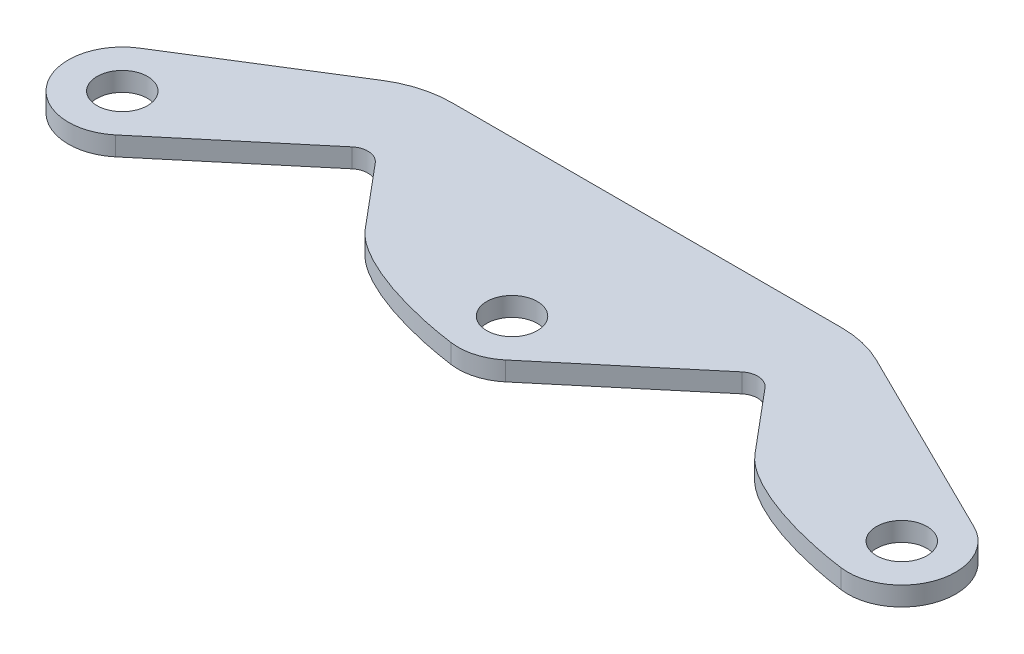
ISO-10303-21;
HEADER;
FILE_DESCRIPTION(('STEP AP214'),'2;1');
FILE_NAME('part.step','',(''),(''),'','','');
FILE_SCHEMA(('AUTOMOTIVE_DESIGN { 1 0 10303 214 1 1 1 1 }'));
ENDSEC;
DATA;
#1=APPLICATION_CONTEXT('core data for automotive mechanical design processes');
#2=APPLICATION_PROTOCOL_DEFINITION('international standard','automotive_design',2000,#1);
#3=PRODUCT_CONTEXT('',#1,'mechanical');
#4=PRODUCT('Part','Part','',(#3));
#5=PRODUCT_RELATED_PRODUCT_CATEGORY('part','',(#4));
#6=PRODUCT_DEFINITION_FORMATION('','',#4);
#7=PRODUCT_DEFINITION_CONTEXT('part definition',#1,'design');
#8=PRODUCT_DEFINITION('design','',#6,#7);
#9=PRODUCT_DEFINITION_SHAPE('','',#8);
#10=(LENGTH_UNIT() NAMED_UNIT(*) SI_UNIT(.MILLI.,.METRE.));
#11=(NAMED_UNIT(*) PLANE_ANGLE_UNIT() SI_UNIT($,.RADIAN.));
#12=(NAMED_UNIT(*) SI_UNIT($,.STERADIAN.) SOLID_ANGLE_UNIT());
#13=UNCERTAINTY_MEASURE_WITH_UNIT(LENGTH_MEASURE(1.E-05),#10,'distance_accuracy_value','');
#14=(GEOMETRIC_REPRESENTATION_CONTEXT(3) GLOBAL_UNCERTAINTY_ASSIGNED_CONTEXT((#13)) GLOBAL_UNIT_ASSIGNED_CONTEXT((#10,
#11,#12)) REPRESENTATION_CONTEXT('',''));
#15=CARTESIAN_POINT('',(0.,0.,0.));
#16=DIRECTION('',(0.,0.,1.));
#17=DIRECTION('',(1.,0.,0.));
#18=AXIS2_PLACEMENT_3D('',#15,#16,#17);
#19=CARTESIAN_POINT('',(-65.,3.175,4.53892574049608E-13));
#20=DIRECTION('',(0.,1.,0.));
#21=DIRECTION('',(0.,0.,1.));
#22=AXIS2_PLACEMENT_3D('',#19,#20,#21);
#23=PLANE('',#22);
#24=CARTESIAN_POINT('',(-65.,3.175,4.53892590361469E-13));
#25=DIRECTION('',(0.,1.,0.));
#26=DIRECTION('',(0.,0.,1.));
#27=AXIS2_PLACEMENT_3D('',#24,#25,#26);
#28=CIRCLE('',#27,4.21639999999987);
#29=CARTESIAN_POINT('',(-65.,3.175,4.21640000000033));
#30=VERTEX_POINT('',#29);
#31=EDGE_CURVE('E353',#30,#30,#28,.T.);
#32=ORIENTED_EDGE('',*,*,#31,.F.);
#33=EDGE_LOOP('',(#32));
#34=FACE_BOUND('',#33,.T.);
#35=CARTESIAN_POINT('',(-130.,3.175,9.07785148099215E-13));
#36=DIRECTION('',(0.,1.,0.));
#37=DIRECTION('',(0.,0.,1.));
#38=AXIS2_PLACEMENT_3D('',#35,#36,#37);
#39=CIRCLE('',#38,9.);
#40=CARTESIAN_POINT('',(-134.772811817146,3.175,-7.63022066247776));
#41=VERTEX_POINT('',#40);
#42=CARTESIAN_POINT('',(-124.214911512821,3.175,6.89439998807173));
#43=VERTEX_POINT('',#42);
#44=EDGE_CURVE('E211',#41,#43,#39,.T.);
#45=ORIENTED_EDGE('',*,*,#44,.T.);
#46=DIRECTION('',(0.766044443118981,0.,-0.642787609686536));
#47=VECTOR('',#46,1.);
#48=CARTESIAN_POINT('',(-124.214911512821,3.175,6.89439998807173));
#49=LINE('',#48,#47);
#50=CARTESIAN_POINT('',(-102.76566710549,3.175,-11.1036530831513));
#51=VERTEX_POINT('',#50);
#52=EDGE_CURVE('E119',#43,#51,#49,.T.);
#53=ORIENTED_EDGE('',*,*,#52,.T.);
#54=CARTESIAN_POINT('',(-100.83730427643,3.175,-8.80551975379434));
#55=DIRECTION('',(0.,-1.,0.));
#56=DIRECTION('',(0.,0.,1.));
#57=AXIS2_PLACEMENT_3D('',#54,#55,#56);
#58=CIRCLE('',#57,3.);
#59=CARTESIAN_POINT('',(-98.5391709470731,3.175,-10.733882582854));
#60=VERTEX_POINT('',#59);
#61=EDGE_CURVE('E250',#51,#60,#58,.T.);
#62=ORIENTED_EDGE('',*,*,#61,.T.);
#63=DIRECTION('',(0.64278760968654,0.,0.766044443118977));
#64=VECTOR('',#63,1.);
#65=CARTESIAN_POINT('',(-89.7352473954924,3.175,-0.241775061332787));
#66=LINE('',#65,#64);
#67=CARTESIAN_POINT('',(-89.7352473954924,3.175,-0.24177506133276));
#68=VERTEX_POINT('',#67);
#69=EDGE_CURVE('E269',#60,#68,#66,.T.);
#70=ORIENTED_EDGE('',*,*,#69,.T.);
#71=CARTESIAN_POINT('',(-65.,3.175,4.53892574049608E-13));
#72=DIRECTION('',(0.,1.,0.));
#73=DIRECTION('',(-0.990268068741571,0.,-0.139173100960064));
#74=AXIS2_PLACEMENT_3D('',#71,#72,#73);
#75=ELLIPSE('',#74,26.2466533784144,8.99999999999999);
#76=CARTESIAN_POINT('',(-66.2525579086406,3.175,8.91241261867458));
#77=VERTEX_POINT('',#76);
#78=EDGE_CURVE('E266',#68,#77,#75,.T.);
#79=ORIENTED_EDGE('',*,*,#78,.T.);
#80=CARTESIAN_POINT('',(-65.,3.175,4.53892590361469E-13));
#81=DIRECTION('',(0.,1.,0.));
#82=DIRECTION('',(0.,0.,1.));
#83=AXIS2_PLACEMENT_3D('',#80,#81,#82);
#84=CIRCLE('',#83,9.);
#85=CARTESIAN_POINT('',(-59.2149115128212,3.175,6.89439998807127));
#86=VERTEX_POINT('',#85);
#87=EDGE_CURVE('E268',#77,#86,#84,.T.);
#88=ORIENTED_EDGE('',*,*,#87,.T.);
#89=DIRECTION('',(0.766044443118981,0.,-0.642787609686536));
#90=VECTOR('',#89,1.);
#91=CARTESIAN_POINT('',(-59.2149115128212,3.175,6.89439998807127));
#92=LINE('',#91,#90);
#93=CARTESIAN_POINT('',(-37.7656671054897,3.175,-11.1036530831517));
#94=VERTEX_POINT('',#93);
#95=EDGE_CURVE('E271',#86,#94,#92,.T.);
#96=ORIENTED_EDGE('',*,*,#95,.T.);
#97=CARTESIAN_POINT('',(-35.8373042764301,3.175,-8.8055197537948));
#98=DIRECTION('',(0.,-1.,0.));
#99=DIRECTION('',(0.,0.,1.));
#100=AXIS2_PLACEMENT_3D('',#97,#98,#99);
#101=CIRCLE('',#100,3.);
#102=CARTESIAN_POINT('',(-33.5391709470732,3.175,-10.7338825828544));
#103=VERTEX_POINT('',#102);
#104=EDGE_CURVE('E530',#94,#103,#101,.T.);
#105=ORIENTED_EDGE('',*,*,#104,.T.);
#106=DIRECTION('',(0.64278760968654,0.,0.766044443118978));
#107=VECTOR('',#106,1.);
#108=CARTESIAN_POINT('',(-24.7352473954924,3.175,-0.241775061333241));
#109=LINE('',#108,#107);
#110=CARTESIAN_POINT('',(-24.7352473954924,3.175,-0.241775061333241));
#111=VERTEX_POINT('',#110);
#112=EDGE_CURVE('E335',#103,#111,#109,.T.);
#113=ORIENTED_EDGE('',*,*,#112,.T.);
#114=CARTESIAN_POINT('',(0.,3.175,0.));
#115=DIRECTION('',(0.,1.,0.));
#116=DIRECTION('',(-0.99026806874157,0.,-0.139173100960066));
#117=AXIS2_PLACEMENT_3D('',#114,#115,#116);
#118=ELLIPSE('',#117,26.2466533784144,8.99999999999999);
#119=CARTESIAN_POINT('',(-1.25255790864059,3.175,8.91241261867412));
#120=VERTEX_POINT('',#119);
#121=EDGE_CURVE('E330',#111,#120,#118,.T.);
#122=ORIENTED_EDGE('',*,*,#121,.T.);
#123=CARTESIAN_POINT('',(0.,3.175,0.));
#124=DIRECTION('',(0.,1.,0.));
#125=DIRECTION('',(0.,0.,1.));
#126=AXIS2_PLACEMENT_3D('',#123,#124,#125);
#127=CIRCLE('',#126,8.99999999999999);
#128=CARTESIAN_POINT('',(3.9911232090901,3.175,-8.06665578352406));
#129=VERTEX_POINT('',#128);
#130=EDGE_CURVE('E334',#120,#129,#127,.T.);
#131=ORIENTED_EDGE('',*,*,#130,.T.);
#132=DIRECTION('',(-0.89629508705823,0.,-0.443458134343345));
#133=VECTOR('',#132,1.);
#134=CARTESIAN_POINT('',(-28.2985159925923,3.175,-24.0425362337842));
#135=LINE('',#134,#133);
#136=CARTESIAN_POINT('',(-28.2985159925923,3.175,-24.0425362337842));
#137=VERTEX_POINT('',#136);
#138=EDGE_CURVE('E338',#129,#137,#135,.T.);
#139=ORIENTED_EDGE('',*,*,#138,.T.);
#140=CARTESIAN_POINT('',(-35.8373042764292,3.175,-8.80551975379434));
#141=DIRECTION('',(0.,1.,0.));
#142=DIRECTION('',(0.,0.,-1.));
#143=AXIS2_PLACEMENT_3D('',#140,#141,#142);
#144=CIRCLE('',#143,17.);
#145=CARTESIAN_POINT('',(-35.8373042764292,3.175,-25.8055197537943));
#146=VERTEX_POINT('',#145);
#147=EDGE_CURVE('E162',#137,#146,#144,.T.);
#148=ORIENTED_EDGE('',*,*,#147,.T.);
#149=DIRECTION('',(-1.,0.,0.));
#150=VECTOR('',#149,1.);
#151=CARTESIAN_POINT('',(-100.83730427643,3.175,-25.8055197537943));
#152=LINE('',#151,#150);
#153=CARTESIAN_POINT('',(-100.83730427643,3.175,-25.8055197537943));
#154=VERTEX_POINT('',#153);
#155=EDGE_CURVE('E156',#146,#154,#152,.T.);
#156=ORIENTED_EDGE('',*,*,#155,.T.);
#157=CARTESIAN_POINT('',(-100.83730427643,3.175,-8.80551975379434));
#158=DIRECTION('',(0.,1.,0.));
#159=DIRECTION('',(0.,0.,-1.));
#160=AXIS2_PLACEMENT_3D('',#157,#158,#159);
#161=CIRCLE('',#160,17.);
#162=CARTESIAN_POINT('',(-109.852615486594,3.175,-23.2181587829207));
#163=VERTEX_POINT('',#162);
#164=EDGE_CURVE('E160',#154,#163,#161,.T.);
#165=ORIENTED_EDGE('',*,*,#164,.T.);
#166=DIRECTION('',(-0.847802295830963,0.,0.530312424127276));
#167=VECTOR('',#166,1.);
#168=CARTESIAN_POINT('',(-134.772811817146,3.175,-7.63022066247776));
#169=LINE('',#168,#167);
#170=EDGE_CURVE('E52',#163,#41,#169,.T.);
#171=ORIENTED_EDGE('',*,*,#170,.T.);
#172=EDGE_LOOP('',(#45,#53,#62,#70,#79,#88,#96,#105,#113,#122,#131,#139,#148,#156,#165,#171));
#173=FACE_BOUND('',#172,.T.);
#174=CARTESIAN_POINT('',(0.,3.175,0.));
#175=DIRECTION('',(0.,1.,0.));
#176=DIRECTION('',(0.,0.,1.));
#177=AXIS2_PLACEMENT_3D('',#174,#175,#176);
#178=CIRCLE('',#177,4.2164);
#179=CARTESIAN_POINT('',(0.,3.175,4.2164));
#180=VERTEX_POINT('',#179);
#181=EDGE_CURVE('E184',#180,#180,#178,.T.);
#182=ORIENTED_EDGE('',*,*,#181,.F.);
#183=EDGE_LOOP('',(#182));
#184=FACE_BOUND('',#183,.T.);
#185=CARTESIAN_POINT('',(-130.,3.175,9.07785148099215E-13));
#186=DIRECTION('',(0.,1.,0.));
#187=DIRECTION('',(0.,0.,1.));
#188=AXIS2_PLACEMENT_3D('',#185,#186,#187);
#189=CIRCLE('',#188,4.2164000000003);
#190=CARTESIAN_POINT('',(-130.,3.175,4.21640000000121));
#191=VERTEX_POINT('',#190);
#192=EDGE_CURVE('E359',#191,#191,#189,.T.);
#193=ORIENTED_EDGE('',*,*,#192,.F.);
#194=EDGE_LOOP('',(#193));
#195=FACE_BOUND('',#194,.T.);
#196=ADVANCED_FACE('F35',(#34,#173,#184,#195),#23,.T.);
#197=CARTESIAN_POINT('',(-65.,0.,4.53892574049608E-13));
#198=DIRECTION('',(0.,1.,0.));
#199=DIRECTION('',(0.,0.,1.));
#200=AXIS2_PLACEMENT_3D('',#197,#198,#199);
#201=PLANE('',#200);
#202=CARTESIAN_POINT('',(-130.,0.,9.07785148099215E-13));
#203=DIRECTION('',(0.,1.,0.));
#204=DIRECTION('',(0.,0.,1.));
#205=AXIS2_PLACEMENT_3D('',#202,#203,#204);
#206=CIRCLE('',#205,9.);
#207=CARTESIAN_POINT('',(-134.772811817146,0.,-7.63022066247776));
#208=VERTEX_POINT('',#207);
#209=CARTESIAN_POINT('',(-124.214911512821,0.,6.89439998807173));
#210=VERTEX_POINT('',#209);
#211=EDGE_CURVE('E180',#208,#210,#206,.T.);
#212=ORIENTED_EDGE('',*,*,#211,.F.);
#213=DIRECTION('',(-0.847802295830963,0.,0.530312424127276));
#214=VECTOR('',#213,1.);
#215=CARTESIAN_POINT('',(-134.772811817146,0.,-7.63022066247776));
#216=LINE('',#215,#214);
#217=CARTESIAN_POINT('',(-109.852615486594,0.,-23.2181587829207));
#218=VERTEX_POINT('',#217);
#219=EDGE_CURVE('E111',#218,#208,#216,.T.);
#220=ORIENTED_EDGE('',*,*,#219,.F.);
#221=CARTESIAN_POINT('',(-100.83730427643,0.,-8.80551975379434));
#222=DIRECTION('',(0.,1.,0.));
#223=DIRECTION('',(0.,0.,-1.));
#224=AXIS2_PLACEMENT_3D('',#221,#222,#223);
#225=CIRCLE('',#224,17.);
#226=CARTESIAN_POINT('',(-100.83730427643,0.,-25.8055197537943));
#227=VERTEX_POINT('',#226);
#228=EDGE_CURVE('E105',#227,#218,#225,.T.);
#229=ORIENTED_EDGE('',*,*,#228,.F.);
#230=DIRECTION('',(-1.,0.,0.));
#231=VECTOR('',#230,1.);
#232=CARTESIAN_POINT('',(-100.83730427643,0.,-25.8055197537943));
#233=LINE('',#232,#231);
#234=CARTESIAN_POINT('',(-35.8373042764292,0.,-25.8055197537943));
#235=VERTEX_POINT('',#234);
#236=EDGE_CURVE('E170',#235,#227,#233,.T.);
#237=ORIENTED_EDGE('',*,*,#236,.F.);
#238=CARTESIAN_POINT('',(-35.8373042764292,0.,-8.80551975379434));
#239=DIRECTION('',(0.,1.,0.));
#240=DIRECTION('',(0.,0.,-1.));
#241=AXIS2_PLACEMENT_3D('',#238,#239,#240);
#242=CIRCLE('',#241,17.);
#243=CARTESIAN_POINT('',(-28.2985159925923,0.,-24.0425362337842));
#244=VERTEX_POINT('',#243);
#245=EDGE_CURVE('E206',#244,#235,#242,.T.);
#246=ORIENTED_EDGE('',*,*,#245,.F.);
#247=DIRECTION('',(-0.89629508705823,0.,-0.443458134343345));
#248=VECTOR('',#247,1.);
#249=CARTESIAN_POINT('',(-28.2985159925923,0.,-24.0425362337842));
#250=LINE('',#249,#248);
#251=CARTESIAN_POINT('',(3.9911232090901,0.,-8.06665578352406));
#252=VERTEX_POINT('',#251);
#253=EDGE_CURVE('E204',#252,#244,#250,.T.);
#254=ORIENTED_EDGE('',*,*,#253,.F.);
#255=CARTESIAN_POINT('',(0.,0.,0.));
#256=DIRECTION('',(0.,1.,0.));
#257=DIRECTION('',(0.,0.,1.));
#258=AXIS2_PLACEMENT_3D('',#255,#256,#257);
#259=CIRCLE('',#258,8.99999999999999);
#260=CARTESIAN_POINT('',(-1.25255790864059,0.,8.91241261867412));
#261=VERTEX_POINT('',#260);
#262=EDGE_CURVE('E202',#261,#252,#259,.T.);
#263=ORIENTED_EDGE('',*,*,#262,.F.);
#264=CARTESIAN_POINT('',(0.,0.,0.));
#265=DIRECTION('',(0.,1.,0.));
#266=DIRECTION('',(-0.99026806874157,0.,-0.139173100960066));
#267=AXIS2_PLACEMENT_3D('',#264,#265,#266);
#268=ELLIPSE('',#267,26.2466533784144,8.99999999999999);
#269=CARTESIAN_POINT('',(-24.7352473954924,0.,-0.241775061333241));
#270=VERTEX_POINT('',#269);
#271=EDGE_CURVE('E200',#270,#261,#268,.T.);
#272=ORIENTED_EDGE('',*,*,#271,.F.);
#273=DIRECTION('',(0.64278760968654,0.,0.766044443118978));
#274=VECTOR('',#273,1.);
#275=CARTESIAN_POINT('',(-24.7352473954924,0.,-0.241775061333241));
#276=LINE('',#275,#274);
#277=CARTESIAN_POINT('',(-33.5391709470732,0.,-10.7338825828544));
#278=VERTEX_POINT('',#277);
#279=EDGE_CURVE('E198',#278,#270,#276,.T.);
#280=ORIENTED_EDGE('',*,*,#279,.F.);
#281=CARTESIAN_POINT('',(-35.8373042764301,0.,-8.8055197537948));
#282=DIRECTION('',(0.,-1.,0.));
#283=DIRECTION('',(0.,0.,1.));
#284=AXIS2_PLACEMENT_3D('',#281,#282,#283);
#285=CIRCLE('',#284,3.);
#286=CARTESIAN_POINT('',(-37.7656671054897,0.,-11.1036530831517));
#287=VERTEX_POINT('',#286);
#288=EDGE_CURVE('E196',#287,#278,#285,.T.);
#289=ORIENTED_EDGE('',*,*,#288,.F.);
#290=DIRECTION('',(0.766044443118981,0.,-0.642787609686536));
#291=VECTOR('',#290,1.);
#292=CARTESIAN_POINT('',(-59.2149115128212,0.,6.89439998807127));
#293=LINE('',#292,#291);
#294=CARTESIAN_POINT('',(-59.2149115128212,0.,6.89439998807127));
#295=VERTEX_POINT('',#294);
#296=EDGE_CURVE('E194',#295,#287,#293,.T.);
#297=ORIENTED_EDGE('',*,*,#296,.F.);
#298=CARTESIAN_POINT('',(-65.,0.,4.53892590361469E-13));
#299=DIRECTION('',(0.,1.,0.));
#300=DIRECTION('',(0.,0.,1.));
#301=AXIS2_PLACEMENT_3D('',#298,#299,#300);
#302=CIRCLE('',#301,9.);
#303=CARTESIAN_POINT('',(-66.2525579086406,0.,8.91241261867458));
#304=VERTEX_POINT('',#303);
#305=EDGE_CURVE('E192',#304,#295,#302,.T.);
#306=ORIENTED_EDGE('',*,*,#305,.F.);
#307=CARTESIAN_POINT('',(-65.,0.,4.53892574049608E-13));
#308=DIRECTION('',(0.,1.,0.));
#309=DIRECTION('',(-0.990268068741571,0.,-0.139173100960064));
#310=AXIS2_PLACEMENT_3D('',#307,#308,#309);
#311=ELLIPSE('',#310,26.2466533784144,8.99999999999999);
#312=CARTESIAN_POINT('',(-89.7352473954924,0.,-0.24177506133276));
#313=VERTEX_POINT('',#312);
#314=EDGE_CURVE('E190',#313,#304,#311,.T.);
#315=ORIENTED_EDGE('',*,*,#314,.F.);
#316=DIRECTION('',(0.64278760968654,0.,0.766044443118977));
#317=VECTOR('',#316,1.);
#318=CARTESIAN_POINT('',(-89.7352473954924,0.,-0.241775061332787));
#319=LINE('',#318,#317);
#320=CARTESIAN_POINT('',(-98.5391709470731,0.,-10.733882582854));
#321=VERTEX_POINT('',#320);
#322=EDGE_CURVE('E188',#321,#313,#319,.T.);
#323=ORIENTED_EDGE('',*,*,#322,.F.);
#324=CARTESIAN_POINT('',(-100.83730427643,0.,-8.80551975379434));
#325=DIRECTION('',(0.,-1.,0.));
#326=DIRECTION('',(0.,0.,1.));
#327=AXIS2_PLACEMENT_3D('',#324,#325,#326);
#328=CIRCLE('',#327,3.);
#329=CARTESIAN_POINT('',(-102.76566710549,0.,-11.1036530831513));
#330=VERTEX_POINT('',#329);
#331=EDGE_CURVE('E186',#330,#321,#328,.T.);
#332=ORIENTED_EDGE('',*,*,#331,.F.);
#333=DIRECTION('',(0.766044443118981,0.,-0.642787609686536));
#334=VECTOR('',#333,1.);
#335=CARTESIAN_POINT('',(-124.214911512821,0.,6.89439998807173));
#336=LINE('',#335,#334);
#337=EDGE_CURVE('E183',#210,#330,#336,.T.);
#338=ORIENTED_EDGE('',*,*,#337,.F.);
#339=EDGE_LOOP('',(#212,#220,#229,#237,#246,#254,#263,#272,#280,#289,#297,#306,#315,#323,#332,#338));
#340=FACE_BOUND('',#339,.T.);
#341=CARTESIAN_POINT('',(0.,0.,0.));
#342=DIRECTION('',(0.,1.,0.));
#343=DIRECTION('',(0.,0.,1.));
#344=AXIS2_PLACEMENT_3D('',#341,#342,#343);
#345=CIRCLE('',#344,4.2164);
#346=CARTESIAN_POINT('',(0.,0.,4.2164));
#347=VERTEX_POINT('',#346);
#348=EDGE_CURVE('E350',#347,#347,#345,.T.);
#349=ORIENTED_EDGE('',*,*,#348,.T.);
#350=EDGE_LOOP('',(#349));
#351=FACE_BOUND('',#350,.T.);
#352=CARTESIAN_POINT('',(-65.,0.,4.53892590361469E-13));
#353=DIRECTION('',(0.,1.,0.));
#354=DIRECTION('',(0.,0.,1.));
#355=AXIS2_PLACEMENT_3D('',#352,#353,#354);
#356=CIRCLE('',#355,4.21639999999987);
#357=CARTESIAN_POINT('',(-65.,0.,4.21640000000033));
#358=VERTEX_POINT('',#357);
#359=EDGE_CURVE('E356',#358,#358,#356,.T.);
#360=ORIENTED_EDGE('',*,*,#359,.T.);
#361=EDGE_LOOP('',(#360));
#362=FACE_BOUND('',#361,.T.);
#363=CARTESIAN_POINT('',(-130.,0.,9.07785148099215E-13));
#364=DIRECTION('',(0.,1.,0.));
#365=DIRECTION('',(0.,0.,1.));
#366=AXIS2_PLACEMENT_3D('',#363,#364,#365);
#367=CIRCLE('',#366,4.2164000000003);
#368=CARTESIAN_POINT('',(-130.,0.,4.21640000000121));
#369=VERTEX_POINT('',#368);
#370=EDGE_CURVE('E362',#369,#369,#367,.T.);
#371=ORIENTED_EDGE('',*,*,#370,.T.);
#372=EDGE_LOOP('',(#371));
#373=FACE_BOUND('',#372,.T.);
#374=ADVANCED_FACE('F254',(#340,#351,#362,#373),#201,.F.);
#375=CARTESIAN_POINT('',(-130.,3.175,9.07785148099215E-13));
#376=DIRECTION('',(0.,-1.,0.));
#377=DIRECTION('',(0.,0.,-1.));
#378=AXIS2_PLACEMENT_3D('',#375,#376,#377);
#379=CYLINDRICAL_SURFACE('',#378,9.);
#380=ORIENTED_EDGE('',*,*,#211,.T.);
#381=DIRECTION('',(0.,-1.,0.));
#382=VECTOR('',#381,1.);
#383=CARTESIAN_POINT('',(-124.214911512821,3.175,6.89439998807173));
#384=LINE('',#383,#382);
#385=EDGE_CURVE('E11',#43,#210,#384,.T.);
#386=ORIENTED_EDGE('',*,*,#385,.F.);
#387=ORIENTED_EDGE('',*,*,#44,.F.);
#388=DIRECTION('',(0.,-1.,0.));
#389=VECTOR('',#388,1.);
#390=CARTESIAN_POINT('',(-134.772811817146,3.175,-7.63022066247776));
#391=LINE('',#390,#389);
#392=EDGE_CURVE('E176',#41,#208,#391,.T.);
#393=ORIENTED_EDGE('',*,*,#392,.T.);
#394=EDGE_LOOP('',(#380,#386,#387,#393));
#395=FACE_BOUND('',#394,.T.);
#396=ADVANCED_FACE('F37',(#395),#379,.T.);
#397=CARTESIAN_POINT('',(-124.214911512821,3.175,6.89439998807173));
#398=DIRECTION('',(-0.642787609686536,0.,-0.766044443118981));
#399=DIRECTION('',(-0.766044443118981,0.,0.642787609686536));
#400=AXIS2_PLACEMENT_3D('',#397,#398,#399);
#401=PLANE('',#400);
#402=ORIENTED_EDGE('',*,*,#337,.T.);
#403=DIRECTION('',(0.,-1.,0.));
#404=VECTOR('',#403,1.);
#405=CARTESIAN_POINT('',(-102.76566710549,3.175,-11.1036530831513));
#406=LINE('',#405,#404);
#407=EDGE_CURVE('E44',#51,#330,#406,.T.);
#408=ORIENTED_EDGE('',*,*,#407,.F.);
#409=ORIENTED_EDGE('',*,*,#52,.F.);
#410=ORIENTED_EDGE('',*,*,#385,.T.);
#411=EDGE_LOOP('',(#402,#408,#409,#410));
#412=FACE_BOUND('',#411,.T.);
#413=ADVANCED_FACE('F286',(#412),#401,.F.);
#414=CARTESIAN_POINT('',(-100.83730427643,3.175,-8.80551975379434));
#415=DIRECTION('',(0.,-1.,0.));
#416=DIRECTION('',(0.,0.,-1.));
#417=AXIS2_PLACEMENT_3D('',#414,#415,#416);
#418=CYLINDRICAL_SURFACE('',#417,3.);
#419=ORIENTED_EDGE('',*,*,#331,.T.);
#420=DIRECTION('',(0.,-1.,0.));
#421=VECTOR('',#420,1.);
#422=CARTESIAN_POINT('',(-98.5391709470731,3.175,-10.733882582854));
#423=LINE('',#422,#421);
#424=EDGE_CURVE('E242',#60,#321,#423,.T.);
#425=ORIENTED_EDGE('',*,*,#424,.F.);
#426=ORIENTED_EDGE('',*,*,#61,.F.);
#427=ORIENTED_EDGE('',*,*,#407,.T.);
#428=EDGE_LOOP('',(#419,#425,#426,#427));
#429=FACE_BOUND('',#428,.T.);
#430=ADVANCED_FACE('F248',(#429),#418,.F.);
#431=CARTESIAN_POINT('',(-89.7352473954924,3.175,-0.241775061332787));
#432=DIRECTION('',(0.766044443118977,0.,-0.64278760968654));
#433=DIRECTION('',(-0.64278760968654,0.,-0.766044443118977));
#434=AXIS2_PLACEMENT_3D('',#431,#432,#433);
#435=PLANE('',#434);
#436=ORIENTED_EDGE('',*,*,#322,.T.);
#437=DIRECTION('',(0.,-1.,0.));
#438=VECTOR('',#437,1.);
#439=CARTESIAN_POINT('',(-89.7352473954924,3.175,-0.24177506133276));
#440=LINE('',#439,#438);
#441=EDGE_CURVE('E239',#68,#313,#440,.T.);
#442=ORIENTED_EDGE('',*,*,#441,.F.);
#443=ORIENTED_EDGE('',*,*,#69,.F.);
#444=ORIENTED_EDGE('',*,*,#424,.T.);
#445=EDGE_LOOP('',(#436,#442,#443,#444));
#446=FACE_BOUND('',#445,.T.);
#447=ADVANCED_FACE('F260',(#446),#435,.F.);
#448=DIRECTION('',(0.,-1.,0.));
#449=VECTOR('',#448,1.);
#450=SURFACE_OF_LINEAR_EXTRUSION('',#75,#449);
#451=ORIENTED_EDGE('',*,*,#314,.T.);
#452=DIRECTION('',(0.,-1.,0.));
#453=VECTOR('',#452,1.);
#454=CARTESIAN_POINT('',(-66.2525579086406,3.175,8.91241261867458));
#455=LINE('',#454,#453);
#456=EDGE_CURVE('E236',#77,#304,#455,.T.);
#457=ORIENTED_EDGE('',*,*,#456,.F.);
#458=ORIENTED_EDGE('',*,*,#78,.F.);
#459=ORIENTED_EDGE('',*,*,#441,.T.);
#460=EDGE_LOOP('',(#451,#457,#458,#459));
#461=FACE_BOUND('',#460,.T.);
#462=ADVANCED_FACE('F264',(#461),#450,.F.);
#463=CARTESIAN_POINT('',(-65.,3.175,4.53892590361469E-13));
#464=DIRECTION('',(0.,-1.,0.));
#465=DIRECTION('',(0.,0.,-1.));
#466=AXIS2_PLACEMENT_3D('',#463,#464,#465);
#467=CYLINDRICAL_SURFACE('',#466,9.);
#468=ORIENTED_EDGE('',*,*,#305,.T.);
#469=DIRECTION('',(0.,-1.,0.));
#470=VECTOR('',#469,1.);
#471=CARTESIAN_POINT('',(-59.2149115128212,3.175,6.89439998807127));
#472=LINE('',#471,#470);
#473=EDGE_CURVE('E233',#86,#295,#472,.T.);
#474=ORIENTED_EDGE('',*,*,#473,.F.);
#475=ORIENTED_EDGE('',*,*,#87,.F.);
#476=ORIENTED_EDGE('',*,*,#456,.T.);
#477=EDGE_LOOP('',(#468,#474,#475,#476));
#478=FACE_BOUND('',#477,.T.);
#479=ADVANCED_FACE('F281',(#478),#467,.T.);
#480=CARTESIAN_POINT('',(-59.2149115128212,3.175,6.89439998807127));
#481=DIRECTION('',(-0.642787609686536,0.,-0.766044443118981));
#482=DIRECTION('',(-0.766044443118981,0.,0.642787609686536));
#483=AXIS2_PLACEMENT_3D('',#480,#481,#482);
#484=PLANE('',#483);
#485=ORIENTED_EDGE('',*,*,#296,.T.);
#486=DIRECTION('',(0.,-1.,0.));
#487=VECTOR('',#486,1.);
#488=CARTESIAN_POINT('',(-37.7656671054897,3.175,-11.1036530831517));
#489=LINE('',#488,#487);
#490=EDGE_CURVE('E230',#94,#287,#489,.T.);
#491=ORIENTED_EDGE('',*,*,#490,.F.);
#492=ORIENTED_EDGE('',*,*,#95,.F.);
#493=ORIENTED_EDGE('',*,*,#473,.T.);
#494=EDGE_LOOP('',(#485,#491,#492,#493));
#495=FACE_BOUND('',#494,.T.);
#496=ADVANCED_FACE('F433',(#495),#484,.F.);
#497=CARTESIAN_POINT('',(-35.8373042764301,3.175,-8.8055197537948));
#498=DIRECTION('',(0.,-1.,0.));
#499=DIRECTION('',(0.,0.,-1.));
#500=AXIS2_PLACEMENT_3D('',#497,#498,#499);
#501=CYLINDRICAL_SURFACE('',#500,3.);
#502=ORIENTED_EDGE('',*,*,#288,.T.);
#503=DIRECTION('',(0.,-1.,0.));
#504=VECTOR('',#503,1.);
#505=CARTESIAN_POINT('',(-33.5391709470732,3.175,-10.7338825828544));
#506=LINE('',#505,#504);
#507=EDGE_CURVE('E227',#103,#278,#506,.T.);
#508=ORIENTED_EDGE('',*,*,#507,.F.);
#509=ORIENTED_EDGE('',*,*,#104,.F.);
#510=ORIENTED_EDGE('',*,*,#490,.T.);
#511=EDGE_LOOP('',(#502,#508,#509,#510));
#512=FACE_BOUND('',#511,.T.);
#513=ADVANCED_FACE('F426',(#512),#501,.F.);
#514=CARTESIAN_POINT('',(-24.7352473954924,3.175,-0.241775061333241));
#515=DIRECTION('',(0.766044443118978,0.,-0.64278760968654));
#516=DIRECTION('',(-0.64278760968654,0.,-0.766044443118978));
#517=AXIS2_PLACEMENT_3D('',#514,#515,#516);
#518=PLANE('',#517);
#519=ORIENTED_EDGE('',*,*,#279,.T.);
#520=DIRECTION('',(0.,-1.,0.));
#521=VECTOR('',#520,1.);
#522=CARTESIAN_POINT('',(-24.7352473954924,3.175,-0.241775061333241));
#523=LINE('',#522,#521);
#524=EDGE_CURVE('E224',#111,#270,#523,.T.);
#525=ORIENTED_EDGE('',*,*,#524,.F.);
#526=ORIENTED_EDGE('',*,*,#112,.F.);
#527=ORIENTED_EDGE('',*,*,#507,.T.);
#528=EDGE_LOOP('',(#519,#525,#526,#527));
#529=FACE_BOUND('',#528,.T.);
#530=ADVANCED_FACE('F327',(#529),#518,.F.);
#531=DIRECTION('',(0.,-1.,0.));
#532=VECTOR('',#531,1.);
#533=SURFACE_OF_LINEAR_EXTRUSION('',#118,#532);
#534=ORIENTED_EDGE('',*,*,#271,.T.);
#535=DIRECTION('',(0.,-1.,0.));
#536=VECTOR('',#535,1.);
#537=CARTESIAN_POINT('',(-1.25255790864059,3.175,8.91241261867412));
#538=LINE('',#537,#536);
#539=EDGE_CURVE('E221',#120,#261,#538,.T.);
#540=ORIENTED_EDGE('',*,*,#539,.F.);
#541=ORIENTED_EDGE('',*,*,#121,.F.);
#542=ORIENTED_EDGE('',*,*,#524,.T.);
#543=EDGE_LOOP('',(#534,#540,#541,#542));
#544=FACE_BOUND('',#543,.T.);
#545=ADVANCED_FACE('F322',(#544),#533,.F.);
#546=CARTESIAN_POINT('',(0.,3.175,0.));
#547=DIRECTION('',(0.,-1.,0.));
#548=DIRECTION('',(0.,0.,-1.));
#549=AXIS2_PLACEMENT_3D('',#546,#547,#548);
#550=CYLINDRICAL_SURFACE('',#549,8.99999999999999);
#551=ORIENTED_EDGE('',*,*,#262,.T.);
#552=DIRECTION('',(0.,-1.,0.));
#553=VECTOR('',#552,1.);
#554=CARTESIAN_POINT('',(3.9911232090901,3.175,-8.06665578352406));
#555=LINE('',#554,#553);
#556=EDGE_CURVE('E218',#129,#252,#555,.T.);
#557=ORIENTED_EDGE('',*,*,#556,.F.);
#558=ORIENTED_EDGE('',*,*,#130,.F.);
#559=ORIENTED_EDGE('',*,*,#539,.T.);
#560=EDGE_LOOP('',(#551,#557,#558,#559));
#561=FACE_BOUND('',#560,.T.);
#562=ADVANCED_FACE('F318',(#561),#550,.T.);
#563=CARTESIAN_POINT('',(-28.2985159925923,3.175,-24.0425362337842));
#564=DIRECTION('',(-0.443458134343345,0.,0.89629508705823));
#565=DIRECTION('',(0.89629508705823,0.,0.443458134343345));
#566=AXIS2_PLACEMENT_3D('',#563,#564,#565);
#567=PLANE('',#566);
#568=ORIENTED_EDGE('',*,*,#253,.T.);
#569=DIRECTION('',(0.,-1.,0.));
#570=VECTOR('',#569,1.);
#571=CARTESIAN_POINT('',(-28.2985159925923,3.175,-24.0425362337842));
#572=LINE('',#571,#570);
#573=EDGE_CURVE('E215',#137,#244,#572,.T.);
#574=ORIENTED_EDGE('',*,*,#573,.F.);
#575=ORIENTED_EDGE('',*,*,#138,.F.);
#576=ORIENTED_EDGE('',*,*,#556,.T.);
#577=EDGE_LOOP('',(#568,#574,#575,#576));
#578=FACE_BOUND('',#577,.T.);
#579=ADVANCED_FACE('F314',(#578),#567,.F.);
#580=CARTESIAN_POINT('',(-35.8373042764292,3.175,-8.80551975379434));
#581=DIRECTION('',(0.,-1.,0.));
#582=DIRECTION('',(0.,0.,-1.));
#583=AXIS2_PLACEMENT_3D('',#580,#581,#582);
#584=CYLINDRICAL_SURFACE('',#583,17.);
#585=ORIENTED_EDGE('',*,*,#245,.T.);
#586=DIRECTION('',(0.,-1.,0.));
#587=VECTOR('',#586,1.);
#588=CARTESIAN_POINT('',(-35.8373042764292,3.175,-25.8055197537943));
#589=LINE('',#588,#587);
#590=EDGE_CURVE('E171',#146,#235,#589,.T.);
#591=ORIENTED_EDGE('',*,*,#590,.F.);
#592=ORIENTED_EDGE('',*,*,#147,.F.);
#593=ORIENTED_EDGE('',*,*,#573,.T.);
#594=EDGE_LOOP('',(#585,#591,#592,#593));
#595=FACE_BOUND('',#594,.T.);
#596=ADVANCED_FACE('F311',(#595),#584,.T.);
#597=CARTESIAN_POINT('',(-100.83730427643,3.175,-25.8055197537943));
#598=DIRECTION('',(0.,0.,1.));
#599=DIRECTION('',(1.,0.,0.));
#600=AXIS2_PLACEMENT_3D('',#597,#598,#599);
#601=PLANE('',#600);
#602=ORIENTED_EDGE('',*,*,#236,.T.);
#603=DIRECTION('',(0.,-1.,0.));
#604=VECTOR('',#603,1.);
#605=CARTESIAN_POINT('',(-100.83730427643,3.175,-25.8055197537943));
#606=LINE('',#605,#604);
#607=EDGE_CURVE('E167',#154,#227,#606,.T.);
#608=ORIENTED_EDGE('',*,*,#607,.F.);
#609=ORIENTED_EDGE('',*,*,#155,.F.);
#610=ORIENTED_EDGE('',*,*,#590,.T.);
#611=EDGE_LOOP('',(#602,#608,#609,#610));
#612=FACE_BOUND('',#611,.T.);
#613=ADVANCED_FACE('F168',(#612),#601,.F.);
#614=CARTESIAN_POINT('',(-100.83730427643,3.175,-8.80551975379434));
#615=DIRECTION('',(0.,-1.,0.));
#616=DIRECTION('',(0.,0.,-1.));
#617=AXIS2_PLACEMENT_3D('',#614,#615,#616);
#618=CYLINDRICAL_SURFACE('',#617,17.);
#619=ORIENTED_EDGE('',*,*,#228,.T.);
#620=DIRECTION('',(0.,-1.,0.));
#621=VECTOR('',#620,1.);
#622=CARTESIAN_POINT('',(-109.852615486594,3.175,-23.2181587829207));
#623=LINE('',#622,#621);
#624=EDGE_CURVE('E172',#163,#218,#623,.T.);
#625=ORIENTED_EDGE('',*,*,#624,.F.);
#626=ORIENTED_EDGE('',*,*,#164,.F.);
#627=ORIENTED_EDGE('',*,*,#607,.T.);
#628=EDGE_LOOP('',(#619,#625,#626,#627));
#629=FACE_BOUND('',#628,.T.);
#630=ADVANCED_FACE('F174',(#629),#618,.T.);
#631=CARTESIAN_POINT('',(-134.772811817146,3.175,-7.63022066247776));
#632=DIRECTION('',(0.530312424127276,0.,0.847802295830963));
#633=DIRECTION('',(0.847802295830963,0.,-0.530312424127276));
#634=AXIS2_PLACEMENT_3D('',#631,#632,#633);
#635=PLANE('',#634);
#636=ORIENTED_EDGE('',*,*,#219,.T.);
#637=ORIENTED_EDGE('',*,*,#392,.F.);
#638=ORIENTED_EDGE('',*,*,#170,.F.);
#639=ORIENTED_EDGE('',*,*,#624,.T.);
#640=EDGE_LOOP('',(#636,#637,#638,#639));
#641=FACE_BOUND('',#640,.T.);
#642=ADVANCED_FACE('F304',(#641),#635,.F.);
#643=CARTESIAN_POINT('',(0.,3.175,0.));
#644=DIRECTION('',(0.,-1.,0.));
#645=DIRECTION('',(0.,0.,-1.));
#646=AXIS2_PLACEMENT_3D('',#643,#644,#645);
#647=CYLINDRICAL_SURFACE('',#646,4.2164);
#648=ORIENTED_EDGE('',*,*,#181,.T.);
#649=EDGE_LOOP('',(#648));
#650=FACE_BOUND('',#649,.T.);
#651=ORIENTED_EDGE('',*,*,#348,.F.);
#652=EDGE_LOOP('',(#651));
#653=FACE_BOUND('',#652,.T.);
#654=ADVANCED_FACE('F301',(#650,#653),#647,.F.);
#655=CARTESIAN_POINT('',(-65.,3.175,4.53892590361469E-13));
#656=DIRECTION('',(0.,-1.,0.));
#657=DIRECTION('',(0.,0.,-1.));
#658=AXIS2_PLACEMENT_3D('',#655,#656,#657);
#659=CYLINDRICAL_SURFACE('',#658,4.21639999999987);
#660=ORIENTED_EDGE('',*,*,#31,.T.);
#661=EDGE_LOOP('',(#660));
#662=FACE_BOUND('',#661,.T.);
#663=ORIENTED_EDGE('',*,*,#359,.F.);
#664=EDGE_LOOP('',(#663));
#665=FACE_BOUND('',#664,.T.);
#666=ADVANCED_FACE('F372',(#662,#665),#659,.F.);
#667=CARTESIAN_POINT('',(-130.,3.175,9.07785148099215E-13));
#668=DIRECTION('',(0.,-1.,0.));
#669=DIRECTION('',(0.,0.,-1.));
#670=AXIS2_PLACEMENT_3D('',#667,#668,#669);
#671=CYLINDRICAL_SURFACE('',#670,4.2164000000003);
#672=ORIENTED_EDGE('',*,*,#192,.T.);
#673=EDGE_LOOP('',(#672));
#674=FACE_BOUND('',#673,.T.);
#675=ORIENTED_EDGE('',*,*,#370,.F.);
#676=EDGE_LOOP('',(#675));
#677=FACE_BOUND('',#676,.T.);
#678=ADVANCED_FACE('F368',(#674,#677),#671,.F.);
#679=CLOSED_SHELL('',(#196,#374,#396,#413,#430,#447,#462,#479,#496,#513,#530,#545,#562,#579,
#596,#613,#630,#642,#654,#666,#678));
#680=MANIFOLD_SOLID_BREP('B2',#679);
#681=ADVANCED_BREP_SHAPE_REPRESENTATION('',(#18,#680),#14);
#682=SHAPE_DEFINITION_REPRESENTATION(#9,#681);
ENDSEC;
END-ISO-10303-21;
